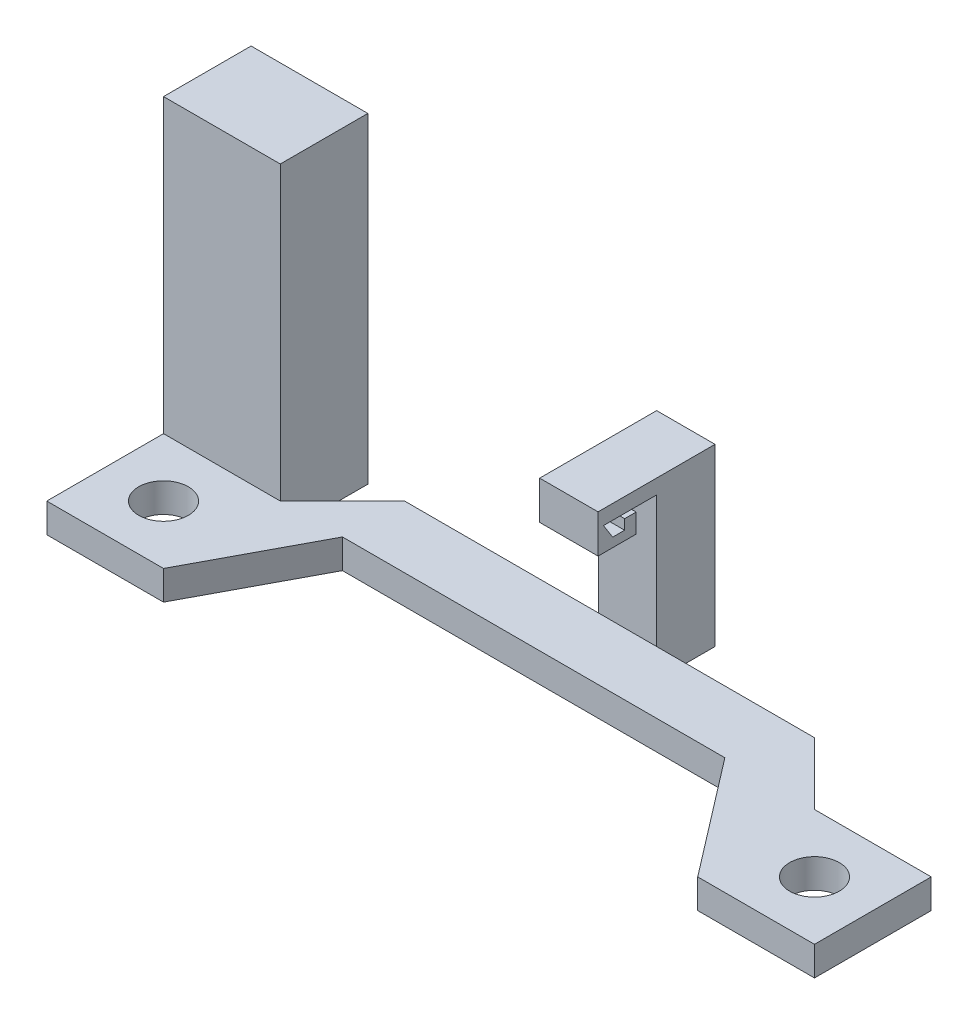
ISO-10303-21;
HEADER;
FILE_DESCRIPTION(('STEP AP214'),'2;1');
FILE_NAME('part.step','',(''),(''),'','','');
FILE_SCHEMA(('AUTOMOTIVE_DESIGN { 1 0 10303 214 1 1 1 1 }'));
ENDSEC;
DATA;
#1=APPLICATION_CONTEXT('core data for automotive mechanical design processes');
#2=APPLICATION_PROTOCOL_DEFINITION('international standard','automotive_design',2000,#1);
#3=PRODUCT_CONTEXT('',#1,'mechanical');
#4=PRODUCT('Part','Part','',(#3));
#5=PRODUCT_RELATED_PRODUCT_CATEGORY('part','',(#4));
#6=PRODUCT_DEFINITION_FORMATION('','',#4);
#7=PRODUCT_DEFINITION_CONTEXT('part definition',#1,'design');
#8=PRODUCT_DEFINITION('design','',#6,#7);
#9=PRODUCT_DEFINITION_SHAPE('','',#8);
#10=(LENGTH_UNIT() NAMED_UNIT(*) SI_UNIT(.MILLI.,.METRE.));
#11=(NAMED_UNIT(*) PLANE_ANGLE_UNIT() SI_UNIT($,.RADIAN.));
#12=(NAMED_UNIT(*) SI_UNIT($,.STERADIAN.) SOLID_ANGLE_UNIT());
#13=UNCERTAINTY_MEASURE_WITH_UNIT(LENGTH_MEASURE(1.E-05),#10,'distance_accuracy_value','');
#14=(GEOMETRIC_REPRESENTATION_CONTEXT(3) GLOBAL_UNCERTAINTY_ASSIGNED_CONTEXT((#13)) GLOBAL_UNIT_ASSIGNED_CONTEXT((#10,
#11,#12)) REPRESENTATION_CONTEXT('',''));
#15=CARTESIAN_POINT('',(0.,0.,0.));
#16=DIRECTION('',(0.,0.,1.));
#17=DIRECTION('',(1.,0.,0.));
#18=AXIS2_PLACEMENT_3D('',#15,#16,#17);
#19=CARTESIAN_POINT('',(46.1527781522757,2.54,-10.4892218477242));
#20=DIRECTION('',(0.,0.,1.));
#21=DIRECTION('',(1.,0.,0.));
#22=AXIS2_PLACEMENT_3D('',#19,#20,#21);
#23=PLANE('',#22);
#24=DIRECTION('',(-1.,0.,0.));
#25=VECTOR('',#24,1.);
#26=CARTESIAN_POINT('',(46.1527781522757,2.54,-10.4892218477242));
#27=LINE('',#26,#25);
#28=CARTESIAN_POINT('',(27.3386529054238,2.54,-10.4892218477242));
#29=VERTEX_POINT('',#28);
#30=CARTESIAN_POINT('',(10.4892218477242,2.54,-10.4892218477242));
#31=VERTEX_POINT('',#30);
#32=EDGE_CURVE('E57',#29,#31,#27,.T.);
#33=ORIENTED_EDGE('',*,*,#32,.F.);
#34=DIRECTION('',(0.,1.,0.));
#35=VECTOR('',#34,1.);
#36=CARTESIAN_POINT('',(27.3386529054238,0.,-10.4892218477242));
#37=LINE('',#36,#35);
#38=CARTESIAN_POINT('',(27.3386529054238,0.,-10.4892218477242));
#39=VERTEX_POINT('',#38);
#40=EDGE_CURVE('E354',#39,#29,#37,.T.);
#41=ORIENTED_EDGE('',*,*,#40,.F.);
#42=DIRECTION('',(-1.,0.,0.));
#43=VECTOR('',#42,1.);
#44=CARTESIAN_POINT('',(46.1527781522757,0.,-10.4892218477242));
#45=LINE('',#44,#43);
#46=CARTESIAN_POINT('',(10.4892218477242,0.,-10.4892218477242));
#47=VERTEX_POINT('',#46);
#48=EDGE_CURVE('E490',#39,#47,#45,.T.);
#49=ORIENTED_EDGE('',*,*,#48,.T.);
#50=DIRECTION('',(0.,-1.,0.));
#51=VECTOR('',#50,1.);
#52=CARTESIAN_POINT('',(10.4892218477242,2.54,-10.4892218477242));
#53=LINE('',#52,#51);
#54=EDGE_CURVE('E456',#31,#47,#53,.T.);
#55=ORIENTED_EDGE('',*,*,#54,.F.);
#56=EDGE_LOOP('',(#33,#41,#49,#55));
#57=FACE_BOUND('',#56,.T.);
#58=ADVANCED_FACE('F41',(#57),#23,.F.);
#59=CARTESIAN_POINT('',(0.,2.54,0.));
#60=DIRECTION('',(0.,1.,0.));
#61=DIRECTION('',(0.,0.,1.));
#62=AXIS2_PLACEMENT_3D('',#59,#60,#61);
#63=PLANE('',#62);
#64=CARTESIAN_POINT('',(0.,2.54,0.));
#65=DIRECTION('',(0.,1.,0.));
#66=DIRECTION('',(0.,0.,1.));
#67=AXIS2_PLACEMENT_3D('',#64,#65,#66);
#68=CIRCLE('',#67,2.159);
#69=CARTESIAN_POINT('',(0.,2.54,2.159));
#70=VERTEX_POINT('',#69);
#71=EDGE_CURVE('E409',#70,#70,#68,.T.);
#72=ORIENTED_EDGE('',*,*,#71,.F.);
#73=EDGE_LOOP('',(#72));
#74=FACE_BOUND('',#73,.T.);
#75=DIRECTION('',(-0.707106781186546,0.,0.707106781186549));
#76=VECTOR('',#75,1.);
#77=CARTESIAN_POINT('',(5.08000000000001,2.54,-5.08));
#78=LINE('',#77,#76);
#79=CARTESIAN_POINT('',(5.08000000000001,2.54,-5.08));
#80=VERTEX_POINT('',#79);
#81=EDGE_CURVE('E417',#31,#80,#78,.T.);
#82=ORIENTED_EDGE('',*,*,#81,.T.);
#83=DIRECTION('',(-1.,0.,0.));
#84=VECTOR('',#83,1.);
#85=CARTESIAN_POINT('',(5.08000000000001,2.54,-5.08));
#86=LINE('',#85,#84);
#87=CARTESIAN_POINT('',(-5.08,2.54,-5.08));
#88=VERTEX_POINT('',#87);
#89=EDGE_CURVE('E421',#80,#88,#86,.T.);
#90=ORIENTED_EDGE('',*,*,#89,.T.);
#91=DIRECTION('',(0.,0.,1.));
#92=VECTOR('',#91,1.);
#93=CARTESIAN_POINT('',(-5.08,2.54,-5.08));
#94=LINE('',#93,#92);
#95=CARTESIAN_POINT('',(-5.08,2.54,5.08));
#96=VERTEX_POINT('',#95);
#97=EDGE_CURVE('E426',#88,#96,#94,.T.);
#98=ORIENTED_EDGE('',*,*,#97,.T.);
#99=DIRECTION('',(1.,0.,0.));
#100=VECTOR('',#99,1.);
#101=CARTESIAN_POINT('',(-5.08,2.54,5.08));
#102=LINE('',#101,#100);
#103=CARTESIAN_POINT('',(5.08,2.54,5.08));
#104=VERTEX_POINT('',#103);
#105=EDGE_CURVE('E429',#96,#104,#102,.T.);
#106=ORIENTED_EDGE('',*,*,#105,.T.);
#107=DIRECTION('',(0.469949268426899,0.,-0.882693426453954));
#108=VECTOR('',#107,1.);
#109=CARTESIAN_POINT('',(5.08,2.54,5.08));
#110=LINE('',#109,#108);
#111=CARTESIAN_POINT('',(10.4892218477242,2.54,-5.08));
#112=VERTEX_POINT('',#111);
#113=EDGE_CURVE('E432',#104,#112,#110,.T.);
#114=ORIENTED_EDGE('',*,*,#113,.T.);
#115=DIRECTION('',(1.,0.,0.));
#116=VECTOR('',#115,1.);
#117=CARTESIAN_POINT('',(10.4892218477242,2.54,-5.08));
#118=LINE('',#117,#116);
#119=CARTESIAN_POINT('',(43.7641842977874,2.54,-5.08));
#120=VERTEX_POINT('',#119);
#121=EDGE_CURVE('E435',#112,#120,#118,.T.);
#122=ORIENTED_EDGE('',*,*,#121,.T.);
#123=DIRECTION('',(0.608848582260036,0.,0.793286457643104));
#124=VECTOR('',#123,1.);
#125=CARTESIAN_POINT('',(43.7641842977874,2.54,-5.08));
#126=LINE('',#125,#124);
#127=CARTESIAN_POINT('',(51.562,2.54,5.08));
#128=VERTEX_POINT('',#127);
#129=EDGE_CURVE('E438',#120,#128,#126,.T.);
#130=ORIENTED_EDGE('',*,*,#129,.T.);
#131=DIRECTION('',(1.,0.,0.));
#132=VECTOR('',#131,1.);
#133=CARTESIAN_POINT('',(61.722,2.54,5.08));
#134=LINE('',#133,#132);
#135=CARTESIAN_POINT('',(61.722,2.54,5.08));
#136=VERTEX_POINT('',#135);
#137=EDGE_CURVE('E441',#128,#136,#134,.T.);
#138=ORIENTED_EDGE('',*,*,#137,.T.);
#139=DIRECTION('',(0.,0.,-1.));
#140=VECTOR('',#139,1.);
#141=CARTESIAN_POINT('',(61.722,2.54,-5.08));
#142=LINE('',#141,#140);
#143=CARTESIAN_POINT('',(61.722,2.54,-5.08));
#144=VERTEX_POINT('',#143);
#145=EDGE_CURVE('E444',#136,#144,#142,.T.);
#146=ORIENTED_EDGE('',*,*,#145,.T.);
#147=DIRECTION('',(-1.,0.,0.));
#148=VECTOR('',#147,1.);
#149=CARTESIAN_POINT('',(56.642,2.54,-5.08));
#150=LINE('',#149,#148);
#151=CARTESIAN_POINT('',(51.562,2.54,-5.08));
#152=VERTEX_POINT('',#151);
#153=EDGE_CURVE('E447',#144,#152,#150,.T.);
#154=ORIENTED_EDGE('',*,*,#153,.T.);
#155=DIRECTION('',(-0.707106781186551,0.,-0.707106781186544));
#156=VECTOR('',#155,1.);
#157=CARTESIAN_POINT('',(51.562,2.54,-5.08));
#158=LINE('',#157,#156);
#159=CARTESIAN_POINT('',(46.1527781522757,2.54,-10.4892218477242));
#160=VERTEX_POINT('',#159);
#161=EDGE_CURVE('E450',#152,#160,#158,.T.);
#162=ORIENTED_EDGE('',*,*,#161,.T.);
#163=CARTESIAN_POINT('',(32.4186529054238,2.54,-10.4892218477242));
#164=VERTEX_POINT('',#163);
#165=EDGE_CURVE('E453',#160,#164,#27,.T.);
#166=ORIENTED_EDGE('',*,*,#165,.T.);
#167=EDGE_CURVE('E457',#164,#29,#27,.T.);
#168=ORIENTED_EDGE('',*,*,#167,.T.);
#169=ORIENTED_EDGE('',*,*,#32,.T.);
#170=EDGE_LOOP('',(#82,#90,#98,#106,#114,#122,#130,#138,#146,#154,#162,#166,#168,#169));
#171=FACE_BOUND('',#170,.T.);
#172=CARTESIAN_POINT('',(56.642,2.54,0.));
#173=DIRECTION('',(0.,1.,0.));
#174=DIRECTION('',(0.,0.,1.));
#175=AXIS2_PLACEMENT_3D('',#172,#173,#174);
#176=CIRCLE('',#175,2.15899999999999);
#177=CARTESIAN_POINT('',(56.642,2.54,2.15899999999999));
#178=VERTEX_POINT('',#177);
#179=EDGE_CURVE('E401',#178,#178,#176,.T.);
#180=ORIENTED_EDGE('',*,*,#179,.F.);
#181=EDGE_LOOP('',(#180));
#182=FACE_BOUND('',#181,.T.);
#183=ADVANCED_FACE('F558',(#74,#171,#182),#63,.T.);
#184=CARTESIAN_POINT('',(0.,0.,0.));
#185=DIRECTION('',(0.,1.,0.));
#186=DIRECTION('',(0.,0.,1.));
#187=AXIS2_PLACEMENT_3D('',#184,#185,#186);
#188=PLANE('',#187);
#189=DIRECTION('',(-0.707106781186546,0.,0.707106781186549));
#190=VECTOR('',#189,1.);
#191=CARTESIAN_POINT('',(5.08000000000001,0.,-5.08));
#192=LINE('',#191,#190);
#193=CARTESIAN_POINT('',(5.08000000000001,0.,-5.08));
#194=VERTEX_POINT('',#193);
#195=EDGE_CURVE('E413',#47,#194,#192,.T.);
#196=ORIENTED_EDGE('',*,*,#195,.F.);
#197=ORIENTED_EDGE('',*,*,#48,.F.);
#198=DIRECTION('',(0.,0.,1.));
#199=VECTOR('',#198,1.);
#200=CARTESIAN_POINT('',(27.3386529054238,0.,-15.5692218477242));
#201=LINE('',#200,#199);
#202=CARTESIAN_POINT('',(27.3386529054238,0.,-15.5692218477242));
#203=VERTEX_POINT('',#202);
#204=EDGE_CURVE('E349',#203,#39,#201,.T.);
#205=ORIENTED_EDGE('',*,*,#204,.F.);
#206=DIRECTION('',(-1.,0.,0.));
#207=VECTOR('',#206,1.);
#208=CARTESIAN_POINT('',(32.4186529054238,0.,-15.5692218477242));
#209=LINE('',#208,#207);
#210=CARTESIAN_POINT('',(32.4186529054238,0.,-15.5692218477242));
#211=VERTEX_POINT('',#210);
#212=EDGE_CURVE('E345',#211,#203,#209,.T.);
#213=ORIENTED_EDGE('',*,*,#212,.F.);
#214=DIRECTION('',(0.,0.,-1.));
#215=VECTOR('',#214,1.);
#216=CARTESIAN_POINT('',(32.4186529054238,0.,-10.4892218477242));
#217=LINE('',#216,#215);
#218=CARTESIAN_POINT('',(32.4186529054238,0.,-10.4892218477242));
#219=VERTEX_POINT('',#218);
#220=EDGE_CURVE('E237',#219,#211,#217,.T.);
#221=ORIENTED_EDGE('',*,*,#220,.F.);
#222=CARTESIAN_POINT('',(46.1527781522757,0.,-10.4892218477242));
#223=VERTEX_POINT('',#222);
#224=EDGE_CURVE('E422',#223,#219,#45,.T.);
#225=ORIENTED_EDGE('',*,*,#224,.F.);
#226=DIRECTION('',(-0.707106781186551,0.,-0.707106781186544));
#227=VECTOR('',#226,1.);
#228=CARTESIAN_POINT('',(51.562,0.,-5.08));
#229=LINE('',#228,#227);
#230=CARTESIAN_POINT('',(51.562,0.,-5.08));
#231=VERTEX_POINT('',#230);
#232=EDGE_CURVE('E487',#231,#223,#229,.T.);
#233=ORIENTED_EDGE('',*,*,#232,.F.);
#234=DIRECTION('',(-1.,0.,0.));
#235=VECTOR('',#234,1.);
#236=CARTESIAN_POINT('',(51.562,0.,-5.08));
#237=LINE('',#236,#235);
#238=CARTESIAN_POINT('',(61.722,0.,-5.08));
#239=VERTEX_POINT('',#238);
#240=EDGE_CURVE('E484',#239,#231,#237,.T.);
#241=ORIENTED_EDGE('',*,*,#240,.F.);
#242=DIRECTION('',(0.,0.,-1.));
#243=VECTOR('',#242,1.);
#244=CARTESIAN_POINT('',(61.722,0.,-5.08));
#245=LINE('',#244,#243);
#246=CARTESIAN_POINT('',(61.722,0.,5.08));
#247=VERTEX_POINT('',#246);
#248=EDGE_CURVE('E480',#247,#239,#245,.T.);
#249=ORIENTED_EDGE('',*,*,#248,.F.);
#250=DIRECTION('',(1.,0.,0.));
#251=VECTOR('',#250,1.);
#252=CARTESIAN_POINT('',(61.722,0.,5.08));
#253=LINE('',#252,#251);
#254=CARTESIAN_POINT('',(51.562,0.,5.08));
#255=VERTEX_POINT('',#254);
#256=EDGE_CURVE('E477',#255,#247,#253,.T.);
#257=ORIENTED_EDGE('',*,*,#256,.F.);
#258=DIRECTION('',(0.608848582260036,0.,0.793286457643104));
#259=VECTOR('',#258,1.);
#260=CARTESIAN_POINT('',(43.7641842977874,0.,-5.08));
#261=LINE('',#260,#259);
#262=CARTESIAN_POINT('',(43.7641842977874,0.,-5.08));
#263=VERTEX_POINT('',#262);
#264=EDGE_CURVE('E474',#263,#255,#261,.T.);
#265=ORIENTED_EDGE('',*,*,#264,.F.);
#266=DIRECTION('',(1.,0.,0.));
#267=VECTOR('',#266,1.);
#268=CARTESIAN_POINT('',(10.4892218477242,0.,-5.08));
#269=LINE('',#268,#267);
#270=CARTESIAN_POINT('',(10.4892218477242,0.,-5.08));
#271=VERTEX_POINT('',#270);
#272=EDGE_CURVE('E471',#271,#263,#269,.T.);
#273=ORIENTED_EDGE('',*,*,#272,.F.);
#274=DIRECTION('',(0.469949268426899,0.,-0.882693426453954));
#275=VECTOR('',#274,1.);
#276=CARTESIAN_POINT('',(5.08,0.,5.08));
#277=LINE('',#276,#275);
#278=CARTESIAN_POINT('',(5.08,0.,5.08));
#279=VERTEX_POINT('',#278);
#280=EDGE_CURVE('E468',#279,#271,#277,.T.);
#281=ORIENTED_EDGE('',*,*,#280,.F.);
#282=DIRECTION('',(1.,0.,0.));
#283=VECTOR('',#282,1.);
#284=CARTESIAN_POINT('',(0.,0.,5.08));
#285=LINE('',#284,#283);
#286=CARTESIAN_POINT('',(-5.08,0.,5.08));
#287=VERTEX_POINT('',#286);
#288=EDGE_CURVE('E465',#287,#279,#285,.T.);
#289=ORIENTED_EDGE('',*,*,#288,.F.);
#290=DIRECTION('',(0.,0.,1.));
#291=VECTOR('',#290,1.);
#292=CARTESIAN_POINT('',(-5.08,0.,-5.08));
#293=LINE('',#292,#291);
#294=CARTESIAN_POINT('',(-5.08,0.,-12.7));
#295=VERTEX_POINT('',#294);
#296=EDGE_CURVE('E461',#295,#287,#293,.T.);
#297=ORIENTED_EDGE('',*,*,#296,.F.);
#298=DIRECTION('',(1.,0.,0.));
#299=VECTOR('',#298,1.);
#300=CARTESIAN_POINT('',(0.,0.,-12.7));
#301=LINE('',#300,#299);
#302=CARTESIAN_POINT('',(5.08,0.,-12.7));
#303=VERTEX_POINT('',#302);
#304=EDGE_CURVE('E385',#295,#303,#301,.T.);
#305=ORIENTED_EDGE('',*,*,#304,.T.);
#306=DIRECTION('',(0.,0.,1.));
#307=VECTOR('',#306,1.);
#308=CARTESIAN_POINT('',(5.08,0.,0.));
#309=LINE('',#308,#307);
#310=EDGE_CURVE('E382',#303,#194,#309,.T.);
#311=ORIENTED_EDGE('',*,*,#310,.T.);
#312=EDGE_LOOP('',(#196,#197,#205,#213,#221,#225,#233,#241,#249,#257,#265,#273,#281,#289,#297,
#305,#311));
#313=FACE_BOUND('',#312,.T.);
#314=CARTESIAN_POINT('',(0.,0.,0.));
#315=DIRECTION('',(0.,1.,0.));
#316=DIRECTION('',(0.,0.,1.));
#317=AXIS2_PLACEMENT_3D('',#314,#315,#316);
#318=CIRCLE('',#317,2.159);
#319=CARTESIAN_POINT('',(0.,0.,2.159));
#320=VERTEX_POINT('',#319);
#321=EDGE_CURVE('E405',#320,#320,#318,.T.);
#322=ORIENTED_EDGE('',*,*,#321,.T.);
#323=EDGE_LOOP('',(#322));
#324=FACE_BOUND('',#323,.T.);
#325=CARTESIAN_POINT('',(56.642,0.,0.));
#326=DIRECTION('',(0.,1.,0.));
#327=DIRECTION('',(0.,0.,1.));
#328=AXIS2_PLACEMENT_3D('',#325,#326,#327);
#329=CIRCLE('',#328,2.15899999999999);
#330=CARTESIAN_POINT('',(56.642,0.,2.15899999999999));
#331=VERTEX_POINT('',#330);
#332=EDGE_CURVE('E392',#331,#331,#329,.T.);
#333=ORIENTED_EDGE('',*,*,#332,.T.);
#334=EDGE_LOOP('',(#333));
#335=FACE_BOUND('',#334,.T.);
#336=ADVANCED_FACE('F542',(#313,#324,#335),#188,.F.);
#337=CARTESIAN_POINT('',(5.08000000000001,2.54,-5.08));
#338=DIRECTION('',(0.707106781186549,0.,0.707106781186546));
#339=DIRECTION('',(0.707106781186546,0.,-0.707106781186549));
#340=AXIS2_PLACEMENT_3D('',#337,#338,#339);
#341=PLANE('',#340);
#342=ORIENTED_EDGE('',*,*,#195,.T.);
#343=DIRECTION('',(0.,-1.,0.));
#344=VECTOR('',#343,1.);
#345=CARTESIAN_POINT('',(5.08000000000001,2.54,-5.08));
#346=LINE('',#345,#344);
#347=EDGE_CURVE('E11',#80,#194,#346,.T.);
#348=ORIENTED_EDGE('',*,*,#347,.F.);
#349=ORIENTED_EDGE('',*,*,#81,.F.);
#350=ORIENTED_EDGE('',*,*,#54,.T.);
#351=EDGE_LOOP('',(#342,#348,#349,#350));
#352=FACE_BOUND('',#351,.T.);
#353=ADVANCED_FACE('F43',(#352),#341,.F.);
#354=CARTESIAN_POINT('',(-5.08,2.54,-5.08));
#355=DIRECTION('',(1.,0.,0.));
#356=DIRECTION('',(0.,0.,-1.));
#357=AXIS2_PLACEMENT_3D('',#354,#355,#356);
#358=PLANE('',#357);
#359=ORIENTED_EDGE('',*,*,#296,.T.);
#360=DIRECTION('',(0.,-1.,0.));
#361=VECTOR('',#360,1.);
#362=CARTESIAN_POINT('',(-5.08,2.54,5.08));
#363=LINE('',#362,#361);
#364=EDGE_CURVE('E50',#96,#287,#363,.T.);
#365=ORIENTED_EDGE('',*,*,#364,.F.);
#366=ORIENTED_EDGE('',*,*,#97,.F.);
#367=DIRECTION('',(0.,1.,0.));
#368=VECTOR('',#367,1.);
#369=CARTESIAN_POINT('',(-5.08,0.,-5.08));
#370=LINE('',#369,#368);
#371=CARTESIAN_POINT('',(-5.08,27.94,-5.08));
#372=VERTEX_POINT('',#371);
#373=EDGE_CURVE('E393',#88,#372,#370,.T.);
#374=ORIENTED_EDGE('',*,*,#373,.T.);
#375=DIRECTION('',(0.,0.,1.));
#376=VECTOR('',#375,1.);
#377=CARTESIAN_POINT('',(-5.08,27.94,0.));
#378=LINE('',#377,#376);
#379=CARTESIAN_POINT('',(-5.08,27.94,-12.7));
#380=VERTEX_POINT('',#379);
#381=EDGE_CURVE('E374',#380,#372,#378,.T.);
#382=ORIENTED_EDGE('',*,*,#381,.F.);
#383=DIRECTION('',(0.,1.,0.));
#384=VECTOR('',#383,1.);
#385=CARTESIAN_POINT('',(-5.08,0.,-12.7));
#386=LINE('',#385,#384);
#387=EDGE_CURVE('E396',#295,#380,#386,.T.);
#388=ORIENTED_EDGE('',*,*,#387,.F.);
#389=EDGE_LOOP('',(#359,#365,#366,#374,#382,#388));
#390=FACE_BOUND('',#389,.T.);
#391=ADVANCED_FACE('F536',(#390),#358,.F.);
#392=CARTESIAN_POINT('',(0.,2.54,5.08));
#393=DIRECTION('',(0.,0.,-1.));
#394=DIRECTION('',(-1.,0.,0.));
#395=AXIS2_PLACEMENT_3D('',#392,#393,#394);
#396=PLANE('',#395);
#397=ORIENTED_EDGE('',*,*,#288,.T.);
#398=DIRECTION('',(0.,-1.,0.));
#399=VECTOR('',#398,1.);
#400=CARTESIAN_POINT('',(5.08,2.54,5.08));
#401=LINE('',#400,#399);
#402=EDGE_CURVE('E524',#104,#279,#401,.T.);
#403=ORIENTED_EDGE('',*,*,#402,.F.);
#404=ORIENTED_EDGE('',*,*,#105,.F.);
#405=ORIENTED_EDGE('',*,*,#364,.T.);
#406=EDGE_LOOP('',(#397,#403,#404,#405));
#407=FACE_BOUND('',#406,.T.);
#408=ADVANCED_FACE('F532',(#407),#396,.F.);
#409=CARTESIAN_POINT('',(5.08,2.54,5.08));
#410=DIRECTION('',(-0.882693426453954,0.,-0.469949268426899));
#411=DIRECTION('',(-0.469949268426899,0.,0.882693426453954));
#412=AXIS2_PLACEMENT_3D('',#409,#410,#411);
#413=PLANE('',#412);
#414=ORIENTED_EDGE('',*,*,#280,.T.);
#415=DIRECTION('',(0.,-1.,0.));
#416=VECTOR('',#415,1.);
#417=CARTESIAN_POINT('',(10.4892218477242,2.54,-5.08));
#418=LINE('',#417,#416);
#419=EDGE_CURVE('E520',#112,#271,#418,.T.);
#420=ORIENTED_EDGE('',*,*,#419,.F.);
#421=ORIENTED_EDGE('',*,*,#113,.F.);
#422=ORIENTED_EDGE('',*,*,#402,.T.);
#423=EDGE_LOOP('',(#414,#420,#421,#422));
#424=FACE_BOUND('',#423,.T.);
#425=ADVANCED_FACE('F550',(#424),#413,.F.);
#426=CARTESIAN_POINT('',(10.4892218477242,2.54,-5.08));
#427=DIRECTION('',(0.,0.,-1.));
#428=DIRECTION('',(-1.,0.,0.));
#429=AXIS2_PLACEMENT_3D('',#426,#427,#428);
#430=PLANE('',#429);
#431=ORIENTED_EDGE('',*,*,#272,.T.);
#432=DIRECTION('',(0.,-1.,0.));
#433=VECTOR('',#432,1.);
#434=CARTESIAN_POINT('',(43.7641842977874,2.54,-5.08));
#435=LINE('',#434,#433);
#436=EDGE_CURVE('E516',#120,#263,#435,.T.);
#437=ORIENTED_EDGE('',*,*,#436,.F.);
#438=ORIENTED_EDGE('',*,*,#121,.F.);
#439=ORIENTED_EDGE('',*,*,#419,.T.);
#440=EDGE_LOOP('',(#431,#437,#438,#439));
#441=FACE_BOUND('',#440,.T.);
#442=ADVANCED_FACE('F554',(#441),#430,.F.);
#443=CARTESIAN_POINT('',(43.7641842977874,2.54,-5.08));
#444=DIRECTION('',(0.793286457643104,0.,-0.608848582260036));
#445=DIRECTION('',(-0.608848582260036,0.,-0.793286457643104));
#446=AXIS2_PLACEMENT_3D('',#443,#444,#445);
#447=PLANE('',#446);
#448=ORIENTED_EDGE('',*,*,#264,.T.);
#449=DIRECTION('',(0.,-1.,0.));
#450=VECTOR('',#449,1.);
#451=CARTESIAN_POINT('',(51.562,2.54,5.08));
#452=LINE('',#451,#450);
#453=EDGE_CURVE('E512',#128,#255,#452,.T.);
#454=ORIENTED_EDGE('',*,*,#453,.F.);
#455=ORIENTED_EDGE('',*,*,#129,.F.);
#456=ORIENTED_EDGE('',*,*,#436,.T.);
#457=EDGE_LOOP('',(#448,#454,#455,#456));
#458=FACE_BOUND('',#457,.T.);
#459=ADVANCED_FACE('F653',(#458),#447,.F.);
#460=CARTESIAN_POINT('',(61.722,2.54,5.08));
#461=DIRECTION('',(0.,0.,-1.));
#462=DIRECTION('',(-1.,0.,0.));
#463=AXIS2_PLACEMENT_3D('',#460,#461,#462);
#464=PLANE('',#463);
#465=ORIENTED_EDGE('',*,*,#256,.T.);
#466=DIRECTION('',(0.,-1.,0.));
#467=VECTOR('',#466,1.);
#468=CARTESIAN_POINT('',(61.722,2.54,5.08));
#469=LINE('',#468,#467);
#470=EDGE_CURVE('E508',#136,#247,#469,.T.);
#471=ORIENTED_EDGE('',*,*,#470,.F.);
#472=ORIENTED_EDGE('',*,*,#137,.F.);
#473=ORIENTED_EDGE('',*,*,#453,.T.);
#474=EDGE_LOOP('',(#465,#471,#472,#473));
#475=FACE_BOUND('',#474,.T.);
#476=ADVANCED_FACE('F650',(#475),#464,.F.);
#477=CARTESIAN_POINT('',(61.722,2.54,-5.08));
#478=DIRECTION('',(-1.,0.,0.));
#479=DIRECTION('',(0.,0.,1.));
#480=AXIS2_PLACEMENT_3D('',#477,#478,#479);
#481=PLANE('',#480);
#482=ORIENTED_EDGE('',*,*,#248,.T.);
#483=DIRECTION('',(0.,-1.,0.));
#484=VECTOR('',#483,1.);
#485=CARTESIAN_POINT('',(61.722,2.54,-5.08));
#486=LINE('',#485,#484);
#487=EDGE_CURVE('E504',#144,#239,#486,.T.);
#488=ORIENTED_EDGE('',*,*,#487,.F.);
#489=ORIENTED_EDGE('',*,*,#145,.F.);
#490=ORIENTED_EDGE('',*,*,#470,.T.);
#491=EDGE_LOOP('',(#482,#488,#489,#490));
#492=FACE_BOUND('',#491,.T.);
#493=ADVANCED_FACE('F646',(#492),#481,.F.);
#494=CARTESIAN_POINT('',(51.562,2.54,-5.08));
#495=DIRECTION('',(0.,0.,1.));
#496=DIRECTION('',(1.,0.,0.));
#497=AXIS2_PLACEMENT_3D('',#494,#495,#496);
#498=PLANE('',#497);
#499=ORIENTED_EDGE('',*,*,#240,.T.);
#500=DIRECTION('',(0.,-1.,0.));
#501=VECTOR('',#500,1.);
#502=CARTESIAN_POINT('',(51.562,2.54,-5.08));
#503=LINE('',#502,#501);
#504=EDGE_CURVE('E500',#152,#231,#503,.T.);
#505=ORIENTED_EDGE('',*,*,#504,.F.);
#506=ORIENTED_EDGE('',*,*,#153,.F.);
#507=ORIENTED_EDGE('',*,*,#487,.T.);
#508=EDGE_LOOP('',(#499,#505,#506,#507));
#509=FACE_BOUND('',#508,.T.);
#510=ADVANCED_FACE('F634',(#509),#498,.F.);
#511=CARTESIAN_POINT('',(51.562,2.54,-5.08));
#512=DIRECTION('',(-0.707106781186544,0.,0.707106781186551));
#513=DIRECTION('',(0.707106781186551,0.,0.707106781186544));
#514=AXIS2_PLACEMENT_3D('',#511,#512,#513);
#515=PLANE('',#514);
#516=ORIENTED_EDGE('',*,*,#232,.T.);
#517=DIRECTION('',(0.,-1.,0.));
#518=VECTOR('',#517,1.);
#519=CARTESIAN_POINT('',(46.1527781522757,2.54,-10.4892218477242));
#520=LINE('',#519,#518);
#521=EDGE_CURVE('E496',#160,#223,#520,.T.);
#522=ORIENTED_EDGE('',*,*,#521,.F.);
#523=ORIENTED_EDGE('',*,*,#161,.F.);
#524=ORIENTED_EDGE('',*,*,#504,.T.);
#525=EDGE_LOOP('',(#516,#522,#523,#524));
#526=FACE_BOUND('',#525,.T.);
#527=ADVANCED_FACE('F626',(#526),#515,.F.);
#528=ORIENTED_EDGE('',*,*,#224,.T.);
#529=DIRECTION('',(0.,1.,0.));
#530=VECTOR('',#529,1.);
#531=CARTESIAN_POINT('',(32.4186529054238,0.,-10.4892218477242));
#532=LINE('',#531,#530);
#533=EDGE_CURVE('E65',#219,#164,#532,.T.);
#534=ORIENTED_EDGE('',*,*,#533,.T.);
#535=ORIENTED_EDGE('',*,*,#165,.F.);
#536=ORIENTED_EDGE('',*,*,#521,.T.);
#537=EDGE_LOOP('',(#528,#534,#535,#536));
#538=FACE_BOUND('',#537,.T.);
#539=ADVANCED_FACE('F616',(#538),#23,.F.);
#540=CARTESIAN_POINT('',(0.,2.54,0.));
#541=DIRECTION('',(0.,-1.,0.));
#542=DIRECTION('',(0.,0.,-1.));
#543=AXIS2_PLACEMENT_3D('',#540,#541,#542);
#544=CYLINDRICAL_SURFACE('',#543,2.159);
#545=ORIENTED_EDGE('',*,*,#71,.T.);
#546=EDGE_LOOP('',(#545));
#547=FACE_BOUND('',#546,.T.);
#548=ORIENTED_EDGE('',*,*,#321,.F.);
#549=EDGE_LOOP('',(#548));
#550=FACE_BOUND('',#549,.T.);
#551=ADVANCED_FACE('F625',(#547,#550),#544,.F.);
#552=CARTESIAN_POINT('',(56.642,2.54,0.));
#553=DIRECTION('',(0.,-1.,0.));
#554=DIRECTION('',(0.,0.,-1.));
#555=AXIS2_PLACEMENT_3D('',#552,#553,#554);
#556=CYLINDRICAL_SURFACE('',#555,2.15899999999999);
#557=ORIENTED_EDGE('',*,*,#179,.T.);
#558=EDGE_LOOP('',(#557));
#559=FACE_BOUND('',#558,.T.);
#560=ORIENTED_EDGE('',*,*,#332,.F.);
#561=EDGE_LOOP('',(#560));
#562=FACE_BOUND('',#561,.T.);
#563=ADVANCED_FACE('F631',(#559,#562),#556,.F.);
#564=CARTESIAN_POINT('',(5.08,0.,0.));
#565=DIRECTION('',(-1.,0.,0.));
#566=DIRECTION('',(0.,0.,1.));
#567=AXIS2_PLACEMENT_3D('',#564,#565,#566);
#568=PLANE('',#567);
#569=DIRECTION('',(0.,1.,0.));
#570=VECTOR('',#569,1.);
#571=CARTESIAN_POINT('',(5.08,0.,-12.7));
#572=LINE('',#571,#570);
#573=CARTESIAN_POINT('',(5.08,27.94,-12.7));
#574=VERTEX_POINT('',#573);
#575=EDGE_CURVE('E388',#303,#574,#572,.T.);
#576=ORIENTED_EDGE('',*,*,#575,.T.);
#577=DIRECTION('',(0.,0.,1.));
#578=VECTOR('',#577,1.);
#579=CARTESIAN_POINT('',(5.08,27.94,0.));
#580=LINE('',#579,#578);
#581=CARTESIAN_POINT('',(5.08000000000001,27.94,-5.08));
#582=VERTEX_POINT('',#581);
#583=EDGE_CURVE('E357',#574,#582,#580,.T.);
#584=ORIENTED_EDGE('',*,*,#583,.T.);
#585=DIRECTION('',(0.,1.,0.));
#586=VECTOR('',#585,1.);
#587=CARTESIAN_POINT('',(5.08000000000001,0.,-5.08));
#588=LINE('',#587,#586);
#589=EDGE_CURVE('E389',#80,#582,#588,.T.);
#590=ORIENTED_EDGE('',*,*,#589,.F.);
#591=ORIENTED_EDGE('',*,*,#347,.T.);
#592=ORIENTED_EDGE('',*,*,#310,.F.);
#593=EDGE_LOOP('',(#576,#584,#590,#591,#592));
#594=FACE_BOUND('',#593,.T.);
#595=ADVANCED_FACE('F567',(#594),#568,.F.);
#596=CARTESIAN_POINT('',(0.,0.,-5.08));
#597=DIRECTION('',(0.,0.,-1.));
#598=DIRECTION('',(-1.,0.,0.));
#599=AXIS2_PLACEMENT_3D('',#596,#597,#598);
#600=PLANE('',#599);
#601=ORIENTED_EDGE('',*,*,#89,.F.);
#602=ORIENTED_EDGE('',*,*,#589,.T.);
#603=DIRECTION('',(-1.,0.,0.));
#604=VECTOR('',#603,1.);
#605=CARTESIAN_POINT('',(0.,27.94,-5.08));
#606=LINE('',#605,#604);
#607=EDGE_CURVE('E378',#582,#372,#606,.T.);
#608=ORIENTED_EDGE('',*,*,#607,.T.);
#609=ORIENTED_EDGE('',*,*,#373,.F.);
#610=EDGE_LOOP('',(#601,#602,#608,#609));
#611=FACE_BOUND('',#610,.T.);
#612=ADVANCED_FACE('F565',(#611),#600,.F.);
#613=CARTESIAN_POINT('',(0.,0.,-12.7));
#614=DIRECTION('',(0.,0.,1.));
#615=DIRECTION('',(1.,0.,0.));
#616=AXIS2_PLACEMENT_3D('',#613,#614,#615);
#617=PLANE('',#616);
#618=ORIENTED_EDGE('',*,*,#387,.T.);
#619=DIRECTION('',(1.,0.,0.));
#620=VECTOR('',#619,1.);
#621=CARTESIAN_POINT('',(0.,27.94,-12.7));
#622=LINE('',#621,#620);
#623=EDGE_CURVE('E370',#380,#574,#622,.T.);
#624=ORIENTED_EDGE('',*,*,#623,.T.);
#625=ORIENTED_EDGE('',*,*,#575,.F.);
#626=ORIENTED_EDGE('',*,*,#304,.F.);
#627=EDGE_LOOP('',(#618,#624,#625,#626));
#628=FACE_BOUND('',#627,.T.);
#629=ADVANCED_FACE('F575',(#628),#617,.F.);
#630=CARTESIAN_POINT('',(0.,27.94,0.));
#631=DIRECTION('',(0.,1.,0.));
#632=DIRECTION('',(0.,0.,1.));
#633=AXIS2_PLACEMENT_3D('',#630,#631,#632);
#634=PLANE('',#633);
#635=ORIENTED_EDGE('',*,*,#583,.F.);
#636=ORIENTED_EDGE('',*,*,#623,.F.);
#637=ORIENTED_EDGE('',*,*,#381,.T.);
#638=ORIENTED_EDGE('',*,*,#607,.F.);
#639=EDGE_LOOP('',(#635,#636,#637,#638));
#640=FACE_BOUND('',#639,.T.);
#641=ADVANCED_FACE('F573',(#640),#634,.T.);
#642=CARTESIAN_POINT('',(27.3386529054238,0.,-10.4892218477242));
#643=DIRECTION('',(0.,0.,1.));
#644=DIRECTION('',(1.,0.,0.));
#645=AXIS2_PLACEMENT_3D('',#642,#643,#644);
#646=PLANE('',#645);
#647=DIRECTION('',(1.,0.,0.));
#648=VECTOR('',#647,1.);
#649=CARTESIAN_POINT('',(27.3386529054238,13.97,-10.4892218477242));
#650=LINE('',#649,#648);
#651=CARTESIAN_POINT('',(27.3386529054238,13.97,-10.4892218477242));
#652=VERTEX_POINT('',#651);
#653=CARTESIAN_POINT('',(32.4186529054238,13.97,-10.4892218477242));
#654=VERTEX_POINT('',#653);
#655=EDGE_CURVE('E312',#652,#654,#650,.T.);
#656=ORIENTED_EDGE('',*,*,#655,.F.);
#657=EDGE_CURVE('E358',#29,#652,#37,.T.);
#658=ORIENTED_EDGE('',*,*,#657,.F.);
#659=ORIENTED_EDGE('',*,*,#167,.F.);
#660=EDGE_CURVE('E353',#164,#654,#532,.T.);
#661=ORIENTED_EDGE('',*,*,#660,.T.);
#662=EDGE_LOOP('',(#656,#658,#659,#661));
#663=FACE_BOUND('',#662,.T.);
#664=ADVANCED_FACE('F587',(#663),#646,.T.);
#665=CARTESIAN_POINT('',(27.3386529054238,0.,-15.5692218477242));
#666=DIRECTION('',(-1.,0.,0.));
#667=DIRECTION('',(0.,0.,1.));
#668=AXIS2_PLACEMENT_3D('',#665,#666,#667);
#669=PLANE('',#668);
#670=ORIENTED_EDGE('',*,*,#40,.T.);
#671=ORIENTED_EDGE('',*,*,#657,.T.);
#672=DIRECTION('',(0.,0.,-1.));
#673=VECTOR('',#672,1.);
#674=CARTESIAN_POINT('',(27.3386529054238,13.97,-5.86509945621302));
#675=LINE('',#674,#673);
#676=CARTESIAN_POINT('',(27.3386529054238,13.97,-5.86509945621302));
#677=VERTEX_POINT('',#676);
#678=EDGE_CURVE('E249',#677,#652,#675,.T.);
#679=ORIENTED_EDGE('',*,*,#678,.F.);
#680=DIRECTION('',(0.,0.847175941779949,0.531312453900017));
#681=VECTOR('',#680,1.);
#682=CARTESIAN_POINT('',(27.3386529054238,12.7,-6.66158904376588));
#683=LINE('',#682,#681);
#684=CARTESIAN_POINT('',(27.3386529054238,12.7,-6.66158904376588));
#685=VERTEX_POINT('',#684);
#686=EDGE_CURVE('E281',#685,#677,#683,.T.);
#687=ORIENTED_EDGE('',*,*,#686,.F.);
#688=DIRECTION('',(0.,0.,1.));
#689=VECTOR('',#688,1.);
#690=CARTESIAN_POINT('',(27.3386529054238,12.7,-7.27189604881352));
#691=LINE('',#690,#689);
#692=CARTESIAN_POINT('',(27.3386529054238,12.7,-7.70380728338385));
#693=VERTEX_POINT('',#692);
#694=EDGE_CURVE('E278',#693,#685,#691,.T.);
#695=ORIENTED_EDGE('',*,*,#694,.F.);
#696=DIRECTION('',(0.,-1.,0.));
#697=VECTOR('',#696,1.);
#698=CARTESIAN_POINT('',(27.3386529054238,12.7,-7.70380728338385));
#699=LINE('',#698,#697);
#700=CARTESIAN_POINT('',(27.3386529054238,13.5702721354625,-7.70380728338385));
#701=VERTEX_POINT('',#700);
#702=EDGE_CURVE('E274',#701,#693,#699,.T.);
#703=ORIENTED_EDGE('',*,*,#702,.F.);
#704=DIRECTION('',(0.,0.,1.));
#705=VECTOR('',#704,1.);
#706=CARTESIAN_POINT('',(27.3386529054238,13.5702721354625,-7.70380728338385));
#707=LINE('',#706,#705);
#708=CARTESIAN_POINT('',(27.3386529054238,13.5702721354625,-8.70337328338947));
#709=VERTEX_POINT('',#708);
#710=EDGE_CURVE('E270',#709,#701,#707,.T.);
#711=ORIENTED_EDGE('',*,*,#710,.F.);
#712=DIRECTION('',(0.,1.,0.));
#713=VECTOR('',#712,1.);
#714=CARTESIAN_POINT('',(27.3386529054238,13.5702721354625,-8.70337328338947));
#715=LINE('',#714,#713);
#716=CARTESIAN_POINT('',(27.3386529054238,11.9035104124471,-8.70337328338947));
#717=VERTEX_POINT('',#716);
#718=EDGE_CURVE('E261',#717,#709,#715,.T.);
#719=ORIENTED_EDGE('',*,*,#718,.F.);
#720=DIRECTION('',(0.,0.,-1.));
#721=VECTOR('',#720,1.);
#722=CARTESIAN_POINT('',(27.3386529054238,11.9035104124471,-5.39158904376588));
#723=LINE('',#722,#721);
#724=CARTESIAN_POINT('',(27.3386529054238,11.9035104124471,-5.39158904376588));
#725=VERTEX_POINT('',#724);
#726=EDGE_CURVE('E255',#725,#717,#723,.T.);
#727=ORIENTED_EDGE('',*,*,#726,.F.);
#728=DIRECTION('',(0.,-1.,0.));
#729=VECTOR('',#728,1.);
#730=CARTESIAN_POINT('',(27.3386529054238,15.24,-5.39158904376588));
#731=LINE('',#730,#729);
#732=CARTESIAN_POINT('',(27.3386529054238,15.24,-5.39158904376588));
#733=VERTEX_POINT('',#732);
#734=EDGE_CURVE('E243',#733,#725,#731,.T.);
#735=ORIENTED_EDGE('',*,*,#734,.F.);
#736=DIRECTION('',(0.,0.,1.));
#737=VECTOR('',#736,1.);
#738=CARTESIAN_POINT('',(27.3386529054238,15.24,-15.5692218477242));
#739=LINE('',#738,#737);
#740=CARTESIAN_POINT('',(27.3386529054238,15.24,-15.5692218477242));
#741=VERTEX_POINT('',#740);
#742=EDGE_CURVE('E227',#741,#733,#739,.T.);
#743=ORIENTED_EDGE('',*,*,#742,.F.);
#744=DIRECTION('',(0.,1.,0.));
#745=VECTOR('',#744,1.);
#746=CARTESIAN_POINT('',(27.3386529054238,0.,-15.5692218477242));
#747=LINE('',#746,#745);
#748=EDGE_CURVE('E359',#203,#741,#747,.T.);
#749=ORIENTED_EDGE('',*,*,#748,.F.);
#750=ORIENTED_EDGE('',*,*,#204,.T.);
#751=EDGE_LOOP('',(#670,#671,#679,#687,#695,#703,#711,#719,#727,#735,#743,#749,#750));
#752=FACE_BOUND('',#751,.T.);
#753=ADVANCED_FACE('F253',(#752),#669,.T.);
#754=CARTESIAN_POINT('',(32.4186529054238,0.,-15.5692218477242));
#755=DIRECTION('',(0.,0.,-1.));
#756=DIRECTION('',(-1.,0.,0.));
#757=AXIS2_PLACEMENT_3D('',#754,#755,#756);
#758=PLANE('',#757);
#759=ORIENTED_EDGE('',*,*,#748,.T.);
#760=DIRECTION('',(-1.,0.,0.));
#761=VECTOR('',#760,1.);
#762=CARTESIAN_POINT('',(32.4186529054238,15.24,-15.5692218477242));
#763=LINE('',#762,#761);
#764=CARTESIAN_POINT('',(32.4186529054238,15.24,-15.5692218477242));
#765=VERTEX_POINT('',#764);
#766=EDGE_CURVE('E233',#765,#741,#763,.T.);
#767=ORIENTED_EDGE('',*,*,#766,.F.);
#768=DIRECTION('',(0.,1.,0.));
#769=VECTOR('',#768,1.);
#770=CARTESIAN_POINT('',(32.4186529054238,0.,-15.5692218477242));
#771=LINE('',#770,#769);
#772=EDGE_CURVE('E362',#211,#765,#771,.T.);
#773=ORIENTED_EDGE('',*,*,#772,.F.);
#774=ORIENTED_EDGE('',*,*,#212,.T.);
#775=EDGE_LOOP('',(#759,#767,#773,#774));
#776=FACE_BOUND('',#775,.T.);
#777=ADVANCED_FACE('F605',(#776),#758,.T.);
#778=CARTESIAN_POINT('',(32.4186529054238,0.,-10.4892218477242));
#779=DIRECTION('',(1.,0.,0.));
#780=DIRECTION('',(0.,0.,-1.));
#781=AXIS2_PLACEMENT_3D('',#778,#779,#780);
#782=PLANE('',#781);
#783=ORIENTED_EDGE('',*,*,#772,.T.);
#784=DIRECTION('',(0.,0.,-1.));
#785=VECTOR('',#784,1.);
#786=CARTESIAN_POINT('',(32.4186529054238,15.24,-10.4892218477242));
#787=LINE('',#786,#785);
#788=CARTESIAN_POINT('',(32.4186529054238,15.24,-5.39158904376588));
#789=VERTEX_POINT('',#788);
#790=EDGE_CURVE('E315',#789,#765,#787,.T.);
#791=ORIENTED_EDGE('',*,*,#790,.F.);
#792=DIRECTION('',(0.,-1.,0.));
#793=VECTOR('',#792,1.);
#794=CARTESIAN_POINT('',(32.4186529054238,12.7,-5.39158904376588));
#795=LINE('',#794,#793);
#796=CARTESIAN_POINT('',(32.4186529054238,11.9035104124471,-5.39158904376588));
#797=VERTEX_POINT('',#796);
#798=EDGE_CURVE('E246',#789,#797,#795,.T.);
#799=ORIENTED_EDGE('',*,*,#798,.T.);
#800=DIRECTION('',(0.,0.,-1.));
#801=VECTOR('',#800,1.);
#802=CARTESIAN_POINT('',(32.4186529054238,11.9035104124471,-8.70337328338947));
#803=LINE('',#802,#801);
#804=CARTESIAN_POINT('',(32.4186529054238,11.9035104124471,-8.70337328338947));
#805=VERTEX_POINT('',#804);
#806=EDGE_CURVE('E289',#797,#805,#803,.T.);
#807=ORIENTED_EDGE('',*,*,#806,.T.);
#808=DIRECTION('',(0.,1.,0.));
#809=VECTOR('',#808,1.);
#810=CARTESIAN_POINT('',(32.4186529054238,13.5702721354625,-8.70337328338947));
#811=LINE('',#810,#809);
#812=CARTESIAN_POINT('',(32.4186529054238,13.5702721354625,-8.70337328338947));
#813=VERTEX_POINT('',#812);
#814=EDGE_CURVE('E293',#805,#813,#811,.T.);
#815=ORIENTED_EDGE('',*,*,#814,.T.);
#816=DIRECTION('',(0.,0.,1.));
#817=VECTOR('',#816,1.);
#818=CARTESIAN_POINT('',(32.4186529054238,13.5702721354625,-7.70380728338385));
#819=LINE('',#818,#817);
#820=CARTESIAN_POINT('',(32.4186529054238,13.5702721354625,-7.70380728338385));
#821=VERTEX_POINT('',#820);
#822=EDGE_CURVE('E297',#813,#821,#819,.T.);
#823=ORIENTED_EDGE('',*,*,#822,.T.);
#824=DIRECTION('',(0.,-1.,0.));
#825=VECTOR('',#824,1.);
#826=CARTESIAN_POINT('',(32.4186529054238,12.7,-7.70380728338385));
#827=LINE('',#826,#825);
#828=CARTESIAN_POINT('',(32.4186529054238,12.7,-7.70380728338385));
#829=VERTEX_POINT('',#828);
#830=EDGE_CURVE('E301',#821,#829,#827,.T.);
#831=ORIENTED_EDGE('',*,*,#830,.T.);
#832=DIRECTION('',(0.,0.,1.));
#833=VECTOR('',#832,1.);
#834=CARTESIAN_POINT('',(32.4186529054238,12.7,-7.27189604881352));
#835=LINE('',#834,#833);
#836=CARTESIAN_POINT('',(32.4186529054238,12.7,-6.66158904376588));
#837=VERTEX_POINT('',#836);
#838=EDGE_CURVE('E305',#829,#837,#835,.T.);
#839=ORIENTED_EDGE('',*,*,#838,.T.);
#840=DIRECTION('',(0.,0.847175941779949,0.531312453900017));
#841=VECTOR('',#840,1.);
#842=CARTESIAN_POINT('',(32.4186529054238,12.7,-6.66158904376588));
#843=LINE('',#842,#841);
#844=CARTESIAN_POINT('',(32.4186529054238,13.97,-5.86509945621302));
#845=VERTEX_POINT('',#844);
#846=EDGE_CURVE('E264',#837,#845,#843,.T.);
#847=ORIENTED_EDGE('',*,*,#846,.T.);
#848=DIRECTION('',(0.,0.,-1.));
#849=VECTOR('',#848,1.);
#850=CARTESIAN_POINT('',(32.4186529054238,13.97,-6.66158904376588));
#851=LINE('',#850,#849);
#852=EDGE_CURVE('E257',#845,#654,#851,.T.);
#853=ORIENTED_EDGE('',*,*,#852,.T.);
#854=ORIENTED_EDGE('',*,*,#660,.F.);
#855=ORIENTED_EDGE('',*,*,#533,.F.);
#856=ORIENTED_EDGE('',*,*,#220,.T.);
#857=EDGE_LOOP('',(#783,#791,#799,#807,#815,#823,#831,#839,#847,#853,#854,#855,#856));
#858=FACE_BOUND('',#857,.T.);
#859=ADVANCED_FACE('F590',(#858),#782,.T.);
#860=CARTESIAN_POINT('',(0.,15.24,0.));
#861=DIRECTION('',(0.,1.,0.));
#862=DIRECTION('',(0.,0.,1.));
#863=AXIS2_PLACEMENT_3D('',#860,#861,#862);
#864=PLANE('',#863);
#865=ORIENTED_EDGE('',*,*,#742,.T.);
#866=DIRECTION('',(1.,0.,0.));
#867=VECTOR('',#866,1.);
#868=CARTESIAN_POINT('',(27.3386529054238,15.24,-5.39158904376588));
#869=LINE('',#868,#867);
#870=EDGE_CURVE('E231',#733,#789,#869,.T.);
#871=ORIENTED_EDGE('',*,*,#870,.T.);
#872=ORIENTED_EDGE('',*,*,#790,.T.);
#873=ORIENTED_EDGE('',*,*,#766,.T.);
#874=EDGE_LOOP('',(#865,#871,#872,#873));
#875=FACE_BOUND('',#874,.T.);
#876=ADVANCED_FACE('F229',(#875),#864,.T.);
#877=CARTESIAN_POINT('',(27.3386529054238,13.97,-6.66158904376588));
#878=DIRECTION('',(0.,-1.,0.));
#879=DIRECTION('',(0.,0.,-1.));
#880=AXIS2_PLACEMENT_3D('',#877,#878,#879);
#881=PLANE('',#880);
#882=ORIENTED_EDGE('',*,*,#852,.F.);
#883=DIRECTION('',(1.,0.,0.));
#884=VECTOR('',#883,1.);
#885=CARTESIAN_POINT('',(27.3386529054238,13.97,-5.86509945621302));
#886=LINE('',#885,#884);
#887=EDGE_CURVE('E316',#677,#845,#886,.T.);
#888=ORIENTED_EDGE('',*,*,#887,.F.);
#889=ORIENTED_EDGE('',*,*,#678,.T.);
#890=ORIENTED_EDGE('',*,*,#655,.T.);
#891=EDGE_LOOP('',(#882,#888,#889,#890));
#892=FACE_BOUND('',#891,.T.);
#893=ADVANCED_FACE('F594',(#892),#881,.T.);
#894=CARTESIAN_POINT('',(27.3386529054238,12.7,-6.66158904376588));
#895=DIRECTION('',(0.,0.531312453900017,-0.847175941779949));
#896=DIRECTION('',(0.,0.847175941779949,0.531312453900017));
#897=AXIS2_PLACEMENT_3D('',#894,#895,#896);
#898=PLANE('',#897);
#899=ORIENTED_EDGE('',*,*,#846,.F.);
#900=DIRECTION('',(1.,0.,0.));
#901=VECTOR('',#900,1.);
#902=CARTESIAN_POINT('',(27.3386529054238,12.7,-6.66158904376588));
#903=LINE('',#902,#901);
#904=EDGE_CURVE('E320',#685,#837,#903,.T.);
#905=ORIENTED_EDGE('',*,*,#904,.F.);
#906=ORIENTED_EDGE('',*,*,#686,.T.);
#907=ORIENTED_EDGE('',*,*,#887,.T.);
#908=EDGE_LOOP('',(#899,#905,#906,#907));
#909=FACE_BOUND('',#908,.T.);
#910=ADVANCED_FACE('F597',(#909),#898,.T.);
#911=CARTESIAN_POINT('',(27.3386529054238,12.7,-7.27189604881352));
#912=DIRECTION('',(0.,1.,0.));
#913=DIRECTION('',(0.,0.,1.));
#914=AXIS2_PLACEMENT_3D('',#911,#912,#913);
#915=PLANE('',#914);
#916=ORIENTED_EDGE('',*,*,#838,.F.);
#917=DIRECTION('',(1.,0.,0.));
#918=VECTOR('',#917,1.);
#919=CARTESIAN_POINT('',(27.3386529054238,12.7,-7.70380728338385));
#920=LINE('',#919,#918);
#921=EDGE_CURVE('E323',#693,#829,#920,.T.);
#922=ORIENTED_EDGE('',*,*,#921,.F.);
#923=ORIENTED_EDGE('',*,*,#694,.T.);
#924=ORIENTED_EDGE('',*,*,#904,.T.);
#925=EDGE_LOOP('',(#916,#922,#923,#924));
#926=FACE_BOUND('',#925,.T.);
#927=ADVANCED_FACE('F732',(#926),#915,.T.);
#928=CARTESIAN_POINT('',(27.3386529054238,12.7,-7.70380728338385));
#929=DIRECTION('',(0.,0.,1.));
#930=DIRECTION('',(1.,0.,0.));
#931=AXIS2_PLACEMENT_3D('',#928,#929,#930);
#932=PLANE('',#931);
#933=ORIENTED_EDGE('',*,*,#830,.F.);
#934=DIRECTION('',(1.,0.,0.));
#935=VECTOR('',#934,1.);
#936=CARTESIAN_POINT('',(27.3386529054238,13.5702721354625,-7.70380728338385));
#937=LINE('',#936,#935);
#938=EDGE_CURVE('E327',#701,#821,#937,.T.);
#939=ORIENTED_EDGE('',*,*,#938,.F.);
#940=ORIENTED_EDGE('',*,*,#702,.T.);
#941=ORIENTED_EDGE('',*,*,#921,.T.);
#942=EDGE_LOOP('',(#933,#939,#940,#941));
#943=FACE_BOUND('',#942,.T.);
#944=ADVANCED_FACE('F742',(#943),#932,.T.);
#945=CARTESIAN_POINT('',(27.3386529054238,13.5702721354625,-7.70380728338385));
#946=DIRECTION('',(0.,1.,0.));
#947=DIRECTION('',(0.,0.,1.));
#948=AXIS2_PLACEMENT_3D('',#945,#946,#947);
#949=PLANE('',#948);
#950=ORIENTED_EDGE('',*,*,#822,.F.);
#951=DIRECTION('',(1.,0.,0.));
#952=VECTOR('',#951,1.);
#953=CARTESIAN_POINT('',(27.3386529054238,13.5702721354625,-8.70337328338947));
#954=LINE('',#953,#952);
#955=EDGE_CURVE('E330',#709,#813,#954,.T.);
#956=ORIENTED_EDGE('',*,*,#955,.F.);
#957=ORIENTED_EDGE('',*,*,#710,.T.);
#958=ORIENTED_EDGE('',*,*,#938,.T.);
#959=EDGE_LOOP('',(#950,#956,#957,#958));
#960=FACE_BOUND('',#959,.T.);
#961=ADVANCED_FACE('F752',(#960),#949,.T.);
#962=CARTESIAN_POINT('',(27.3386529054238,13.5702721354625,-8.70337328338947));
#963=DIRECTION('',(0.,0.,-1.));
#964=DIRECTION('',(-1.,0.,0.));
#965=AXIS2_PLACEMENT_3D('',#962,#963,#964);
#966=PLANE('',#965);
#967=ORIENTED_EDGE('',*,*,#814,.F.);
#968=DIRECTION('',(1.,0.,0.));
#969=VECTOR('',#968,1.);
#970=CARTESIAN_POINT('',(27.3386529054238,11.9035104124471,-8.70337328338947));
#971=LINE('',#970,#969);
#972=EDGE_CURVE('E333',#717,#805,#971,.T.);
#973=ORIENTED_EDGE('',*,*,#972,.F.);
#974=ORIENTED_EDGE('',*,*,#718,.T.);
#975=ORIENTED_EDGE('',*,*,#955,.T.);
#976=EDGE_LOOP('',(#967,#973,#974,#975));
#977=FACE_BOUND('',#976,.T.);
#978=ADVANCED_FACE('F762',(#977),#966,.T.);
#979=CARTESIAN_POINT('',(27.3386529054238,11.9035104124471,-8.70337328338947));
#980=DIRECTION('',(0.,-1.,0.));
#981=DIRECTION('',(0.,0.,-1.));
#982=AXIS2_PLACEMENT_3D('',#979,#980,#981);
#983=PLANE('',#982);
#984=ORIENTED_EDGE('',*,*,#806,.F.);
#985=DIRECTION('',(1.,0.,0.));
#986=VECTOR('',#985,1.);
#987=CARTESIAN_POINT('',(27.3386529054238,11.9035104124471,-5.39158904376588));
#988=LINE('',#987,#986);
#989=EDGE_CURVE('E248',#725,#797,#988,.T.);
#990=ORIENTED_EDGE('',*,*,#989,.F.);
#991=ORIENTED_EDGE('',*,*,#726,.T.);
#992=ORIENTED_EDGE('',*,*,#972,.T.);
#993=EDGE_LOOP('',(#984,#990,#991,#992));
#994=FACE_BOUND('',#993,.T.);
#995=ADVANCED_FACE('F772',(#994),#983,.T.);
#996=CARTESIAN_POINT('',(27.3386529054238,12.7,-5.39158904376588));
#997=DIRECTION('',(0.,0.,1.));
#998=DIRECTION('',(1.,0.,0.));
#999=AXIS2_PLACEMENT_3D('',#996,#997,#998);
#1000=PLANE('',#999);
#1001=ORIENTED_EDGE('',*,*,#798,.F.);
#1002=ORIENTED_EDGE('',*,*,#870,.F.);
#1003=ORIENTED_EDGE('',*,*,#734,.T.);
#1004=ORIENTED_EDGE('',*,*,#989,.T.);
#1005=EDGE_LOOP('',(#1001,#1002,#1003,#1004));
#1006=FACE_BOUND('',#1005,.T.);
#1007=ADVANCED_FACE('F241',(#1006),#1000,.T.);
#1008=CLOSED_SHELL('',(#58,#183,#336,#353,#391,#408,#425,#442,#459,#476,#493,#510,#527,#539,
#551,#563,#595,#612,#629,#641,#664,#753,#777,#859,#876,#893,#910,#927,#944,#961,#978,#995,#1007));
#1009=MANIFOLD_SOLID_BREP('B2',#1008);
#1010=ADVANCED_BREP_SHAPE_REPRESENTATION('',(#18,#1009),#14);
#1011=SHAPE_DEFINITION_REPRESENTATION(#9,#1010);
ENDSEC;
END-ISO-10303-21;
